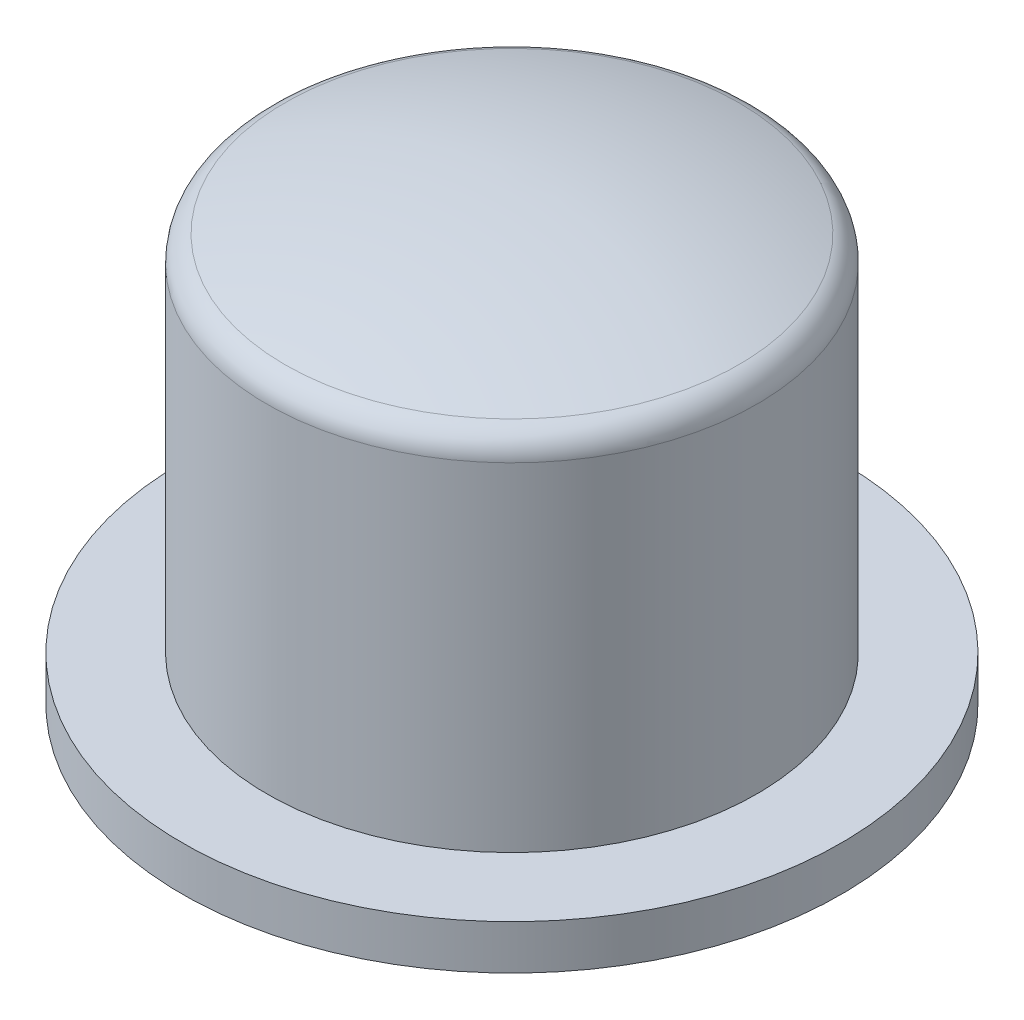
ISO-10303-21;
HEADER;
FILE_DESCRIPTION(('STEP AP214'),'2;1');
FILE_NAME('part.step','',(''),(''),'','','');
FILE_SCHEMA(('AUTOMOTIVE_DESIGN { 1 0 10303 214 1 1 1 1 }'));
ENDSEC;
DATA;
#1=APPLICATION_CONTEXT('core data for automotive mechanical design processes');
#2=APPLICATION_PROTOCOL_DEFINITION('international standard','automotive_design',2000,#1);
#3=PRODUCT_CONTEXT('',#1,'mechanical');
#4=PRODUCT('Part','Part','',(#3));
#5=PRODUCT_RELATED_PRODUCT_CATEGORY('part','',(#4));
#6=PRODUCT_DEFINITION_FORMATION('','',#4);
#7=PRODUCT_DEFINITION_CONTEXT('part definition',#1,'design');
#8=PRODUCT_DEFINITION('design','',#6,#7);
#9=PRODUCT_DEFINITION_SHAPE('','',#8);
#10=(LENGTH_UNIT() NAMED_UNIT(*) SI_UNIT(.MILLI.,.METRE.));
#11=(NAMED_UNIT(*) PLANE_ANGLE_UNIT() SI_UNIT($,.RADIAN.));
#12=(NAMED_UNIT(*) SI_UNIT($,.STERADIAN.) SOLID_ANGLE_UNIT());
#13=UNCERTAINTY_MEASURE_WITH_UNIT(LENGTH_MEASURE(1.E-05),#10,'distance_accuracy_value','');
#14=(GEOMETRIC_REPRESENTATION_CONTEXT(3) GLOBAL_UNCERTAINTY_ASSIGNED_CONTEXT((#13)) GLOBAL_UNIT_ASSIGNED_CONTEXT((#10,
#11,#12)) REPRESENTATION_CONTEXT('',''));
#15=CARTESIAN_POINT('',(0.,0.,0.));
#16=DIRECTION('',(0.,0.,1.));
#17=DIRECTION('',(1.,0.,0.));
#18=AXIS2_PLACEMENT_3D('',#15,#16,#17);
#19=CARTESIAN_POINT('',(0.,-1.21658007352792,0.));
#20=DIRECTION('',(0.,-1.,0.));
#21=DIRECTION('',(0.,0.,-1.));
#22=AXIS2_PLACEMENT_3D('',#19,#20,#21);
#23=CYLINDRICAL_SURFACE('',#22,1.6);
#24=CARTESIAN_POINT('',(0.,3.5,0.));
#25=DIRECTION('',(0.,-1.,0.));
#26=DIRECTION('',(0.,0.,-1.));
#27=AXIS2_PLACEMENT_3D('',#24,#25,#26);
#28=CIRCLE('',#27,1.6);
#29=CARTESIAN_POINT('',(0.,3.5,-1.6));
#30=VERTEX_POINT('',#29);
#31=EDGE_CURVE('E43',#30,#30,#28,.T.);
#32=ORIENTED_EDGE('',*,*,#31,.F.);
#33=EDGE_LOOP('',(#32));
#34=FACE_BOUND('',#33,.T.);
#35=CARTESIAN_POINT('',(0.,0.,0.));
#36=DIRECTION('',(0.,-1.,0.));
#37=DIRECTION('',(0.,0.,-1.));
#38=AXIS2_PLACEMENT_3D('',#35,#36,#37);
#39=CIRCLE('',#38,1.6);
#40=CARTESIAN_POINT('',(0.,0.,-1.6));
#41=VERTEX_POINT('',#40);
#42=EDGE_CURVE('E58',#41,#41,#39,.T.);
#43=ORIENTED_EDGE('',*,*,#42,.T.);
#44=EDGE_LOOP('',(#43));
#45=FACE_BOUND('',#44,.T.);
#46=ADVANCED_FACE('F32',(#34,#45),#23,.F.);
#47=CARTESIAN_POINT('',(0.,3.5,0.));
#48=DIRECTION('',(0.,1.,0.));
#49=DIRECTION('',(0.,0.,1.));
#50=AXIS2_PLACEMENT_3D('',#47,#48,#49);
#51=PLANE('',#50);
#52=ORIENTED_EDGE('',*,*,#31,.T.);
#53=EDGE_LOOP('',(#52));
#54=FACE_BOUND('',#53,.T.);
#55=ADVANCED_FACE('F88',(#54),#51,.F.);
#56=CARTESIAN_POINT('',(0.,-2.81249999999999,0.));
#57=DIRECTION('',(0.,0.,1.));
#58=DIRECTION('',(1.,0.,0.));
#59=AXIS2_PLACEMENT_3D('',#56,#57,#58);
#60=SPHERICAL_SURFACE('',#59,7.81249999999999);
#61=CARTESIAN_POINT('',(0.,-2.81249999999999,0.));
#62=DIRECTION('',(0.,-1.,0.));
#63=DIRECTION('',(0.,0.,-1.));
#64=AXIS2_PLACEMENT_3D('',#61,#62,#63);
#65=SPHERICAL_SURFACE('',#64,7.81249999999999);
#66=CARTESIAN_POINT('',(0.,4.57286953612623,0.));
#67=DIRECTION('',(0.,-1.,0.));
#68=DIRECTION('',(0.,0.,-1.));
#69=AXIS2_PLACEMENT_3D('',#66,#67,#68);
#70=CIRCLE('',#69,2.54783693843594);
#71=CARTESIAN_POINT('',(0.,4.57286953612623,-2.54783693843594));
#72=VERTEX_POINT('',#71);
#73=EDGE_CURVE('E10',#72,#72,#70,.F.);
#74=ORIENTED_EDGE('',*,*,#73,.T.);
#75=EDGE_LOOP('',(#74));
#76=FACE_BOUND('',#75,.T.);
#77=ADVANCED_FACE('F83',(#76),#65,.T.);
#78=CARTESIAN_POINT('',(0.,-1.21658007352792,0.));
#79=DIRECTION('',(0.,-1.,0.));
#80=DIRECTION('',(0.,0.,-1.));
#81=AXIS2_PLACEMENT_3D('',#78,#79,#80);
#82=CYLINDRICAL_SURFACE('',#81,2.75);
#83=CARTESIAN_POINT('',(0.,4.28927134593898,0.));
#84=DIRECTION('',(0.,-1.,0.));
#85=DIRECTION('',(0.,0.,-1.));
#86=AXIS2_PLACEMENT_3D('',#83,#84,#85);
#87=CIRCLE('',#86,2.75);
#88=CARTESIAN_POINT('',(0.,4.28927134593898,-2.75));
#89=VERTEX_POINT('',#88);
#90=EDGE_CURVE('E39',#89,#89,#87,.T.);
#91=ORIENTED_EDGE('',*,*,#90,.T.);
#92=EDGE_LOOP('',(#91));
#93=FACE_BOUND('',#92,.T.);
#94=CARTESIAN_POINT('',(0.,0.5,0.));
#95=DIRECTION('',(0.,-1.,0.));
#96=DIRECTION('',(0.,0.,-1.));
#97=AXIS2_PLACEMENT_3D('',#94,#95,#96);
#98=CIRCLE('',#97,2.75);
#99=CARTESIAN_POINT('',(0.,0.5,-2.75));
#100=VERTEX_POINT('',#99);
#101=EDGE_CURVE('E47',#100,#100,#98,.T.);
#102=ORIENTED_EDGE('',*,*,#101,.F.);
#103=EDGE_LOOP('',(#102));
#104=FACE_BOUND('',#103,.T.);
#105=ADVANCED_FACE('F78',(#93,#104),#82,.T.);
#106=CARTESIAN_POINT('',(-2.75,0.5,0.));
#107=DIRECTION('',(0.,-1.,0.));
#108=DIRECTION('',(0.,0.,-1.));
#109=AXIS2_PLACEMENT_3D('',#106,#107,#108);
#110=PLANE('',#109);
#111=CARTESIAN_POINT('',(0.,0.5,0.));
#112=DIRECTION('',(0.,-1.,0.));
#113=DIRECTION('',(0.,0.,-1.));
#114=AXIS2_PLACEMENT_3D('',#111,#112,#113);
#115=CIRCLE('',#114,3.7);
#116=CARTESIAN_POINT('',(0.,0.5,-3.7));
#117=VERTEX_POINT('',#116);
#118=EDGE_CURVE('E52',#117,#117,#115,.T.);
#119=ORIENTED_EDGE('',*,*,#118,.F.);
#120=EDGE_LOOP('',(#119));
#121=FACE_BOUND('',#120,.T.);
#122=ORIENTED_EDGE('',*,*,#101,.T.);
#123=EDGE_LOOP('',(#122));
#124=FACE_BOUND('',#123,.T.);
#125=ADVANCED_FACE('F72',(#121,#124),#110,.F.);
#126=CARTESIAN_POINT('',(0.,-1.21658007352792,0.));
#127=DIRECTION('',(0.,-1.,0.));
#128=DIRECTION('',(0.,0.,-1.));
#129=AXIS2_PLACEMENT_3D('',#126,#127,#128);
#130=CYLINDRICAL_SURFACE('',#129,3.7);
#131=CARTESIAN_POINT('',(0.,0.,0.));
#132=DIRECTION('',(0.,-1.,0.));
#133=DIRECTION('',(0.,0.,-1.));
#134=AXIS2_PLACEMENT_3D('',#131,#132,#133);
#135=CIRCLE('',#134,3.7);
#136=CARTESIAN_POINT('',(0.,0.,-3.7));
#137=VERTEX_POINT('',#136);
#138=EDGE_CURVE('E55',#137,#137,#135,.T.);
#139=ORIENTED_EDGE('',*,*,#138,.F.);
#140=EDGE_LOOP('',(#139));
#141=FACE_BOUND('',#140,.T.);
#142=ORIENTED_EDGE('',*,*,#118,.T.);
#143=EDGE_LOOP('',(#142));
#144=FACE_BOUND('',#143,.T.);
#145=ADVANCED_FACE('F66',(#141,#144),#130,.T.);
#146=CARTESIAN_POINT('',(-3.7,0.,0.));
#147=DIRECTION('',(0.,1.,0.));
#148=DIRECTION('',(0.,0.,1.));
#149=AXIS2_PLACEMENT_3D('',#146,#147,#148);
#150=PLANE('',#149);
#151=ORIENTED_EDGE('',*,*,#42,.F.);
#152=EDGE_LOOP('',(#151));
#153=FACE_BOUND('',#152,.T.);
#154=ORIENTED_EDGE('',*,*,#138,.T.);
#155=EDGE_LOOP('',(#154));
#156=FACE_BOUND('',#155,.T.);
#157=ADVANCED_FACE('F63',(#153,#156),#150,.F.);
#158=CARTESIAN_POINT('',(0.,4.28927134593898,0.));
#159=DIRECTION('',(0.,-1.,0.));
#160=DIRECTION('',(0.,0.,-1.));
#161=AXIS2_PLACEMENT_3D('',#158,#159,#160);
#162=TOROIDAL_SURFACE('',#161,2.45,0.3);
#163=ORIENTED_EDGE('',*,*,#73,.F.);
#164=EDGE_LOOP('',(#163));
#165=FACE_BOUND('',#164,.T.);
#166=ORIENTED_EDGE('',*,*,#90,.F.);
#167=EDGE_LOOP('',(#166));
#168=FACE_BOUND('',#167,.T.);
#169=ADVANCED_FACE('F34',(#165,#168),#162,.T.);
#170=CLOSED_SHELL('',(#46,#55,#77,#105,#125,#145,#157,#169));
#171=MANIFOLD_SOLID_BREP('B2',#170);
#172=ADVANCED_BREP_SHAPE_REPRESENTATION('',(#18,#171),#14);
#173=SHAPE_DEFINITION_REPRESENTATION(#9,#172);
ENDSEC;
END-ISO-10303-21;
